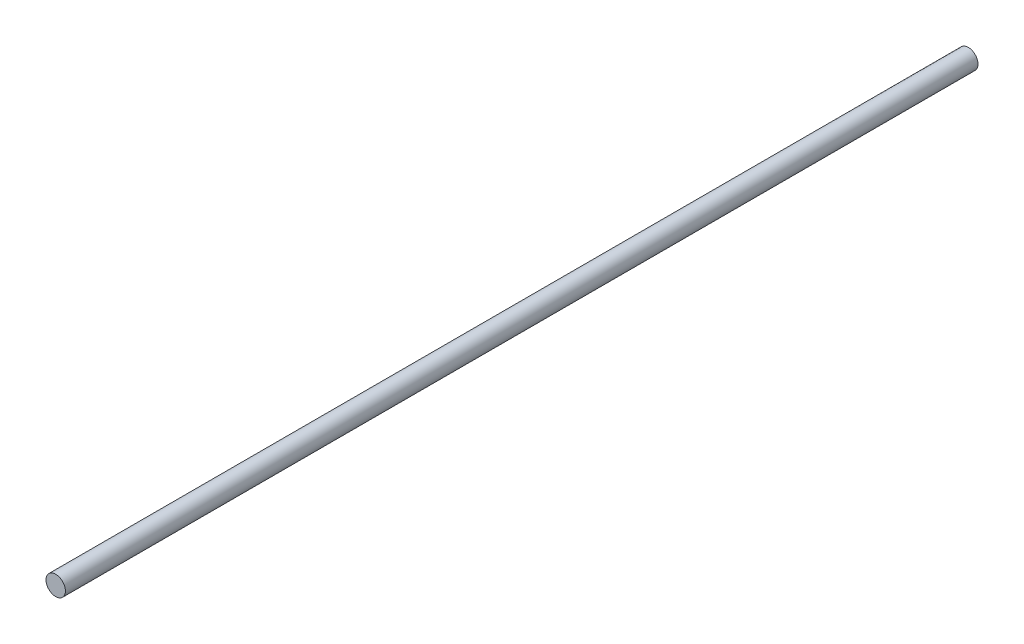
ISO-10303-21;
HEADER;
FILE_DESCRIPTION(('STEP AP214'),'2;1');
FILE_NAME('part.step','',(''),(''),'','','');
FILE_SCHEMA(('AUTOMOTIVE_DESIGN { 1 0 10303 214 1 1 1 1 }'));
ENDSEC;
DATA;
#1=APPLICATION_CONTEXT('core data for automotive mechanical design processes');
#2=APPLICATION_PROTOCOL_DEFINITION('international standard','automotive_design',2000,#1);
#3=PRODUCT_CONTEXT('',#1,'mechanical');
#4=PRODUCT('Part','Part','',(#3));
#5=PRODUCT_RELATED_PRODUCT_CATEGORY('part','',(#4));
#6=PRODUCT_DEFINITION_FORMATION('','',#4);
#7=PRODUCT_DEFINITION_CONTEXT('part definition',#1,'design');
#8=PRODUCT_DEFINITION('design','',#6,#7);
#9=PRODUCT_DEFINITION_SHAPE('','',#8);
#10=(LENGTH_UNIT() NAMED_UNIT(*) SI_UNIT(.MILLI.,.METRE.));
#11=(NAMED_UNIT(*) PLANE_ANGLE_UNIT() SI_UNIT($,.RADIAN.));
#12=(NAMED_UNIT(*) SI_UNIT($,.STERADIAN.) SOLID_ANGLE_UNIT());
#13=UNCERTAINTY_MEASURE_WITH_UNIT(LENGTH_MEASURE(1.E-05),#10,'distance_accuracy_value','');
#14=(GEOMETRIC_REPRESENTATION_CONTEXT(3) GLOBAL_UNCERTAINTY_ASSIGNED_CONTEXT((#13)) GLOBAL_UNIT_ASSIGNED_CONTEXT((#10,
#11,#12)) REPRESENTATION_CONTEXT('',''));
#15=CARTESIAN_POINT('',(0.,0.,0.));
#16=DIRECTION('',(0.,0.,1.));
#17=DIRECTION('',(1.,0.,0.));
#18=AXIS2_PLACEMENT_3D('',#15,#16,#17);
#19=CARTESIAN_POINT('',(0.,0.,-375.7));
#20=DIRECTION('',(0.,0.,1.));
#21=DIRECTION('',(1.,0.,0.));
#22=AXIS2_PLACEMENT_3D('',#19,#20,#21);
#23=CYLINDRICAL_SURFACE('',#22,4.);
#24=CARTESIAN_POINT('',(0.,0.,-375.7));
#25=DIRECTION('',(0.,0.,1.));
#26=DIRECTION('',(1.,0.,0.));
#27=AXIS2_PLACEMENT_3D('',#24,#25,#26);
#28=CIRCLE('',#27,4.);
#29=CARTESIAN_POINT('',(4.,0.,-375.7));
#30=VERTEX_POINT('',#29);
#31=EDGE_CURVE('E10',#30,#30,#28,.T.);
#32=ORIENTED_EDGE('',*,*,#31,.T.);
#33=EDGE_LOOP('',(#32));
#34=FACE_BOUND('',#33,.T.);
#35=CARTESIAN_POINT('',(0.,0.,0.));
#36=DIRECTION('',(0.,0.,1.));
#37=DIRECTION('',(1.,0.,0.));
#38=AXIS2_PLACEMENT_3D('',#35,#36,#37);
#39=CIRCLE('',#38,4.);
#40=CARTESIAN_POINT('',(4.,0.,0.));
#41=VERTEX_POINT('',#40);
#42=EDGE_CURVE('E38',#41,#41,#39,.T.);
#43=ORIENTED_EDGE('',*,*,#42,.F.);
#44=EDGE_LOOP('',(#43));
#45=FACE_BOUND('',#44,.T.);
#46=ADVANCED_FACE('F35',(#34,#45),#23,.T.);
#47=CARTESIAN_POINT('',(0.,0.,-375.7));
#48=DIRECTION('',(0.,0.,1.));
#49=DIRECTION('',(1.,0.,0.));
#50=AXIS2_PLACEMENT_3D('',#47,#48,#49);
#51=PLANE('',#50);
#52=ORIENTED_EDGE('',*,*,#31,.F.);
#53=EDGE_LOOP('',(#52));
#54=FACE_BOUND('',#53,.T.);
#55=ADVANCED_FACE('F50',(#54),#51,.F.);
#56=CARTESIAN_POINT('',(0.,0.,0.));
#57=DIRECTION('',(0.,0.,1.));
#58=DIRECTION('',(1.,0.,0.));
#59=AXIS2_PLACEMENT_3D('',#56,#57,#58);
#60=PLANE('',#59);
#61=ORIENTED_EDGE('',*,*,#42,.T.);
#62=EDGE_LOOP('',(#61));
#63=FACE_BOUND('',#62,.T.);
#64=ADVANCED_FACE('F47',(#63),#60,.T.);
#65=CLOSED_SHELL('',(#46,#55,#64));
#66=MANIFOLD_SOLID_BREP('B2',#65);
#67=ADVANCED_BREP_SHAPE_REPRESENTATION('',(#18,#66),#14);
#68=SHAPE_DEFINITION_REPRESENTATION(#9,#67);
ENDSEC;
END-ISO-10303-21;
